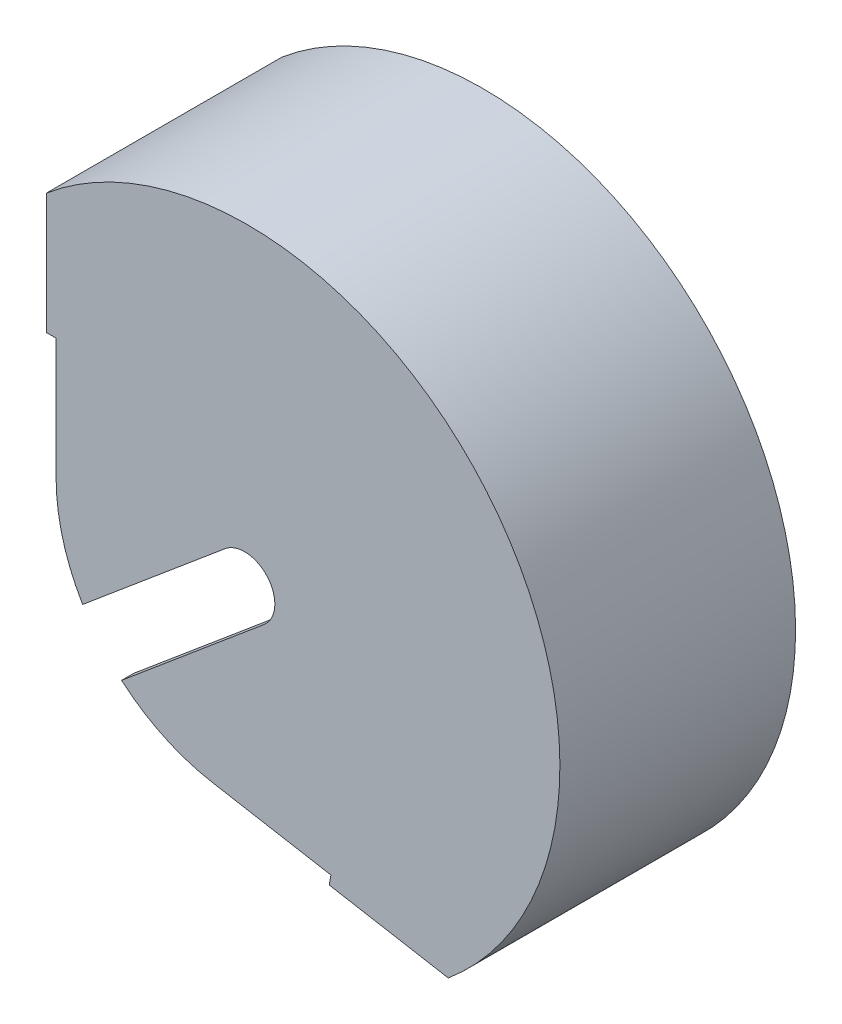
ISO-10303-21;
HEADER;
FILE_DESCRIPTION(('STEP AP214'),'2;1');
FILE_NAME('part.step','',(''),(''),'','','');
FILE_SCHEMA(('AUTOMOTIVE_DESIGN { 1 0 10303 214 1 1 1 1 }'));
ENDSEC;
DATA;
#1=APPLICATION_CONTEXT('core data for automotive mechanical design processes');
#2=APPLICATION_PROTOCOL_DEFINITION('international standard','automotive_design',2000,#1);
#3=PRODUCT_CONTEXT('',#1,'mechanical');
#4=PRODUCT('Part','Part','',(#3));
#5=PRODUCT_RELATED_PRODUCT_CATEGORY('part','',(#4));
#6=PRODUCT_DEFINITION_FORMATION('','',#4);
#7=PRODUCT_DEFINITION_CONTEXT('part definition',#1,'design');
#8=PRODUCT_DEFINITION('design','',#6,#7);
#9=PRODUCT_DEFINITION_SHAPE('','',#8);
#10=(LENGTH_UNIT() NAMED_UNIT(*) SI_UNIT(.MILLI.,.METRE.));
#11=(NAMED_UNIT(*) PLANE_ANGLE_UNIT() SI_UNIT($,.RADIAN.));
#12=(NAMED_UNIT(*) SI_UNIT($,.STERADIAN.) SOLID_ANGLE_UNIT());
#13=UNCERTAINTY_MEASURE_WITH_UNIT(LENGTH_MEASURE(1.E-05),#10,'distance_accuracy_value','');
#14=(GEOMETRIC_REPRESENTATION_CONTEXT(3) GLOBAL_UNCERTAINTY_ASSIGNED_CONTEXT((#13)) GLOBAL_UNIT_ASSIGNED_CONTEXT((#10,
#11,#12)) REPRESENTATION_CONTEXT('',''));
#15=CARTESIAN_POINT('',(0.,0.,0.));
#16=DIRECTION('',(0.,0.,1.));
#17=DIRECTION('',(1.,0.,0.));
#18=AXIS2_PLACEMENT_3D('',#15,#16,#17);
#19=CARTESIAN_POINT('',(0.,0.,46.99));
#20=DIRECTION('',(0.,0.,1.));
#21=DIRECTION('',(1.,0.,0.));
#22=AXIS2_PLACEMENT_3D('',#19,#20,#21);
#23=CYLINDRICAL_SURFACE('',#22,39.624);
#24=DIRECTION('',(0.,0.,1.));
#25=VECTOR('',#24,1.);
#26=CARTESIAN_POINT('',(-34.0431369022995,-20.2762473315773,46.99));
#27=LINE('',#26,#25);
#28=CARTESIAN_POINT('',(-34.0431369022995,-20.2762473315773,46.99));
#29=VERTEX_POINT('',#28);
#30=CARTESIAN_POINT('',(-34.0431369022995,-20.2762473315773,49.53));
#31=VERTEX_POINT('',#30);
#32=EDGE_CURVE('E196',#29,#31,#27,.T.);
#33=ORIENTED_EDGE('',*,*,#32,.T.);
#34=CARTESIAN_POINT('',(0.,0.,49.53));
#35=DIRECTION('',(0.,0.,1.));
#36=DIRECTION('',(1.,0.,0.));
#37=AXIS2_PLACEMENT_3D('',#34,#35,#36);
#38=CIRCLE('',#37,39.624);
#39=CARTESIAN_POINT('',(-39.624,0.,49.53));
#40=VERTEX_POINT('',#39);
#41=EDGE_CURVE('E210',#40,#31,#38,.T.);
#42=ORIENTED_EDGE('',*,*,#41,.F.);
#43=DIRECTION('',(0.,0.,1.));
#44=VECTOR('',#43,1.);
#45=CARTESIAN_POINT('',(-39.624,0.,46.99));
#46=LINE('',#45,#44);
#47=CARTESIAN_POINT('',(-39.624,0.,46.99));
#48=VERTEX_POINT('',#47);
#49=EDGE_CURVE('E234',#48,#40,#46,.T.);
#50=ORIENTED_EDGE('',*,*,#49,.F.);
#51=CARTESIAN_POINT('',(0.,0.,46.99));
#52=DIRECTION('',(0.,0.,1.));
#53=DIRECTION('',(1.,0.,0.));
#54=AXIS2_PLACEMENT_3D('',#51,#52,#53);
#55=CIRCLE('',#54,39.624);
#56=EDGE_CURVE('E212',#48,#29,#55,.T.);
#57=ORIENTED_EDGE('',*,*,#56,.T.);
#58=EDGE_LOOP('',(#33,#42,#50,#57));
#59=FACE_BOUND('',#58,.T.);
#60=ADVANCED_FACE('F44',(#59),#23,.T.);
#61=CARTESIAN_POINT('',(0.,0.,2.54));
#62=DIRECTION('',(0.,0.,1.));
#63=DIRECTION('',(1.,0.,0.));
#64=AXIS2_PLACEMENT_3D('',#61,#62,#63);
#65=PLANE('',#64);
#66=CARTESIAN_POINT('',(0.,0.,2.54));
#67=DIRECTION('',(0.,0.,1.));
#68=DIRECTION('',(1.,0.,0.));
#69=AXIS2_PLACEMENT_3D('',#66,#67,#68);
#70=CIRCLE('',#69,3.81);
#71=CARTESIAN_POINT('',(3.81,0.,2.54));
#72=VERTEX_POINT('',#71);
#73=EDGE_CURVE('E544',#72,#72,#70,.F.);
#74=ORIENTED_EDGE('',*,*,#73,.T.);
#75=EDGE_LOOP('',(#74));
#76=FACE_BOUND('',#75,.T.);
#77=CARTESIAN_POINT('',(2.11621768174401,-33.5316800791596,2.54));
#78=DIRECTION('',(0.,0.,1.));
#79=DIRECTION('',(1.,0.,0.));
#80=AXIS2_PLACEMENT_3D('',#77,#78,#79);
#81=CIRCLE('',#80,3.2639);
#82=CARTESIAN_POINT('',(5.38011768174402,-33.5316800791596,2.54));
#83=VERTEX_POINT('',#82);
#84=EDGE_CURVE('E532',#83,#83,#81,.F.);
#85=ORIENTED_EDGE('',*,*,#84,.T.);
#86=EDGE_LOOP('',(#85));
#87=FACE_BOUND('',#86,.T.);
#88=CARTESIAN_POINT('',(-33.2774928980017,10.1739505809418,2.54));
#89=DIRECTION('',(0.,0.,1.));
#90=DIRECTION('',(1.,0.,0.));
#91=AXIS2_PLACEMENT_3D('',#88,#89,#90);
#92=CIRCLE('',#91,3.2639);
#93=CARTESIAN_POINT('',(-30.0135928980017,10.1739505809418,2.54));
#94=VERTEX_POINT('',#93);
#95=EDGE_CURVE('E528',#94,#94,#92,.F.);
#96=ORIENTED_EDGE('',*,*,#95,.T.);
#97=EDGE_LOOP('',(#96));
#98=FACE_BOUND('',#97,.T.);
#99=CARTESIAN_POINT('',(0.569372682063345,0.477760407521777,2.54));
#100=DIRECTION('',(0.,0.,1.));
#101=DIRECTION('',(1.,0.,0.));
#102=AXIS2_PLACEMENT_3D('',#99,#100,#101);
#103=CIRCLE('',#102,63.1510183795466);
#104=CARTESIAN_POINT('',(41.1620648355229,-47.8987262994342,2.54));
#105=VERTEX_POINT('',#104);
#106=CARTESIAN_POINT('',(-40.0233194713961,48.8542471144778,2.54));
#107=VERTEX_POINT('',#106);
#108=EDGE_CURVE('E68',#105,#107,#103,.T.);
#109=ORIENTED_EDGE('',*,*,#108,.T.);
#110=DIRECTION('',(-1.,0.,0.));
#111=VECTOR('',#110,1.);
#112=CARTESIAN_POINT('',(0.,48.8542471144778,2.54));
#113=LINE('',#112,#111);
#114=CARTESIAN_POINT('',(-41.656,48.8542471144778,2.54));
#115=VERTEX_POINT('',#114);
#116=EDGE_CURVE('E260',#107,#115,#113,.T.);
#117=ORIENTED_EDGE('',*,*,#116,.T.);
#118=DIRECTION('',(0.,1.,0.));
#119=VECTOR('',#118,1.);
#120=CARTESIAN_POINT('',(-41.656,0.,2.54));
#121=LINE('',#120,#119);
#122=CARTESIAN_POINT('',(-41.656,25.4,2.54));
#123=VERTEX_POINT('',#122);
#124=EDGE_CURVE('E308',#123,#115,#121,.T.);
#125=ORIENTED_EDGE('',*,*,#124,.F.);
#126=DIRECTION('',(-1.,0.,0.));
#127=VECTOR('',#126,1.);
#128=CARTESIAN_POINT('',(0.,25.4,2.54));
#129=LINE('',#128,#127);
#130=CARTESIAN_POINT('',(-39.624,25.4,2.54));
#131=VERTEX_POINT('',#130);
#132=EDGE_CURVE('E312',#131,#123,#129,.T.);
#133=ORIENTED_EDGE('',*,*,#132,.F.);
#134=DIRECTION('',(0.,1.,0.));
#135=VECTOR('',#134,1.);
#136=CARTESIAN_POINT('',(-39.624,0.,2.54));
#137=LINE('',#136,#135);
#138=CARTESIAN_POINT('',(-39.624,0.,2.54));
#139=VERTEX_POINT('',#138);
#140=EDGE_CURVE('E291',#139,#131,#137,.T.);
#141=ORIENTED_EDGE('',*,*,#140,.F.);
#142=CARTESIAN_POINT('',(0.,0.,2.54));
#143=DIRECTION('',(0.,0.,1.));
#144=DIRECTION('',(1.,0.,0.));
#145=AXIS2_PLACEMENT_3D('',#142,#143,#144);
#146=CIRCLE('',#145,39.624);
#147=CARTESIAN_POINT('',(-6.88063539187432,-39.0220224053558,2.54));
#148=VERTEX_POINT('',#147);
#149=EDGE_CURVE('E295',#139,#148,#146,.T.);
#150=ORIENTED_EDGE('',*,*,#149,.T.);
#151=DIRECTION('',(0.984807753012209,-0.173648177666927,0.));
#152=VECTOR('',#151,1.);
#153=CARTESIAN_POINT('',(-6.88063539187431,-39.0220224053558,2.54));
#154=LINE('',#153,#152);
#155=CARTESIAN_POINT('',(18.1334815346358,-43.4326861180957,2.54));
#156=VERTEX_POINT('',#155);
#157=EDGE_CURVE('E299',#148,#156,#154,.T.);
#158=ORIENTED_EDGE('',*,*,#157,.T.);
#159=DIRECTION('',(-0.173648177666925,-0.984807753012209,0.));
#160=VECTOR('',#159,1.);
#161=CARTESIAN_POINT('',(25.01411692651,-4.41066371273988,2.54));
#162=LINE('',#161,#160);
#163=CARTESIAN_POINT('',(17.7806284376166,-45.4338154722165,2.54));
#164=VERTEX_POINT('',#163);
#165=EDGE_CURVE('E302',#156,#164,#162,.T.);
#166=ORIENTED_EDGE('',*,*,#165,.T.);
#167=DIRECTION('',(0.984807753012209,-0.173648177666927,0.));
#168=VECTOR('',#167,1.);
#169=CARTESIAN_POINT('',(-7.23348848889351,-41.0231517594766,2.54));
#170=LINE('',#169,#168);
#171=CARTESIAN_POINT('',(40.8785528370185,-49.5066027421954,2.54));
#172=VERTEX_POINT('',#171);
#173=EDGE_CURVE('E305',#164,#172,#170,.T.);
#174=ORIENTED_EDGE('',*,*,#173,.T.);
#175=DIRECTION('',(-0.173648177666925,-0.984807753012209,0.));
#176=VECTOR('',#175,1.);
#177=CARTESIAN_POINT('',(48.112041325912,-8.48345098271867,2.54));
#178=LINE('',#177,#176);
#179=EDGE_CURVE('E270',#105,#172,#178,.T.);
#180=ORIENTED_EDGE('',*,*,#179,.F.);
#181=EDGE_LOOP('',(#109,#117,#125,#133,#141,#150,#158,#166,#174,#180));
#182=FACE_BOUND('',#181,.T.);
#183=ADVANCED_FACE('F388',(#76,#87,#98,#182),#65,.T.);
#184=CARTESIAN_POINT('',(-39.624,0.,2.54));
#185=DIRECTION('',(-1.,0.,0.));
#186=DIRECTION('',(0.,0.,1.));
#187=AXIS2_PLACEMENT_3D('',#184,#185,#186);
#188=PLANE('',#187);
#189=DIRECTION('',(0.,1.,0.));
#190=VECTOR('',#189,1.);
#191=CARTESIAN_POINT('',(-39.624,0.,0.));
#192=LINE('',#191,#190);
#193=CARTESIAN_POINT('',(-39.624,0.,0.));
#194=VERTEX_POINT('',#193);
#195=CARTESIAN_POINT('',(-39.624,25.4,0.));
#196=VERTEX_POINT('',#195);
#197=EDGE_CURVE('E290',#194,#196,#192,.T.);
#198=ORIENTED_EDGE('',*,*,#197,.F.);
#199=DIRECTION('',(0.,0.,-1.));
#200=VECTOR('',#199,1.);
#201=CARTESIAN_POINT('',(-39.624,0.,2.54));
#202=LINE('',#201,#200);
#203=EDGE_CURVE('E11',#139,#194,#202,.T.);
#204=ORIENTED_EDGE('',*,*,#203,.F.);
#205=ORIENTED_EDGE('',*,*,#140,.T.);
#206=DIRECTION('',(0.,0.,-1.));
#207=VECTOR('',#206,1.);
#208=CARTESIAN_POINT('',(-39.624,25.4,2.54));
#209=LINE('',#208,#207);
#210=EDGE_CURVE('E316',#131,#196,#209,.T.);
#211=ORIENTED_EDGE('',*,*,#210,.T.);
#212=EDGE_LOOP('',(#198,#204,#205,#211));
#213=FACE_BOUND('',#212,.T.);
#214=ADVANCED_FACE('F46',(#213),#188,.T.);
#215=CARTESIAN_POINT('',(0.,0.,2.54));
#216=DIRECTION('',(0.,0.,-1.));
#217=DIRECTION('',(-1.,0.,0.));
#218=AXIS2_PLACEMENT_3D('',#215,#216,#217);
#219=CYLINDRICAL_SURFACE('',#218,39.624);
#220=CARTESIAN_POINT('',(0.,0.,0.));
#221=DIRECTION('',(0.,0.,1.));
#222=DIRECTION('',(1.,0.,0.));
#223=AXIS2_PLACEMENT_3D('',#220,#221,#222);
#224=CIRCLE('',#223,39.624);
#225=CARTESIAN_POINT('',(-6.88063539187432,-39.0220224053558,0.));
#226=VERTEX_POINT('',#225);
#227=EDGE_CURVE('E320',#194,#226,#224,.T.);
#228=ORIENTED_EDGE('',*,*,#227,.T.);
#229=DIRECTION('',(0.,0.,-1.));
#230=VECTOR('',#229,1.);
#231=CARTESIAN_POINT('',(-6.88063539187432,-39.0220224053558,2.54));
#232=LINE('',#231,#230);
#233=EDGE_CURVE('E53',#148,#226,#232,.T.);
#234=ORIENTED_EDGE('',*,*,#233,.F.);
#235=ORIENTED_EDGE('',*,*,#149,.F.);
#236=ORIENTED_EDGE('',*,*,#203,.T.);
#237=EDGE_LOOP('',(#228,#234,#235,#236));
#238=FACE_BOUND('',#237,.T.);
#239=ADVANCED_FACE('F411',(#238),#219,.T.);
#240=CARTESIAN_POINT('',(-6.88063539187431,-39.0220224053558,2.54));
#241=DIRECTION('',(0.173648177666927,0.984807753012209,0.));
#242=DIRECTION('',(-0.984807753012209,0.173648177666927,0.));
#243=AXIS2_PLACEMENT_3D('',#240,#241,#242);
#244=PLANE('',#243);
#245=DIRECTION('',(0.984807753012209,-0.173648177666927,0.));
#246=VECTOR('',#245,1.);
#247=CARTESIAN_POINT('',(-6.88063539187431,-39.0220224053558,0.));
#248=LINE('',#247,#246);
#249=CARTESIAN_POINT('',(18.1334815346358,-43.4326861180957,0.));
#250=VERTEX_POINT('',#249);
#251=EDGE_CURVE('E323',#226,#250,#248,.T.);
#252=ORIENTED_EDGE('',*,*,#251,.T.);
#253=DIRECTION('',(0.,0.,-1.));
#254=VECTOR('',#253,1.);
#255=CARTESIAN_POINT('',(18.1334815346358,-43.4326861180957,2.54));
#256=LINE('',#255,#254);
#257=EDGE_CURVE('E359',#156,#250,#256,.T.);
#258=ORIENTED_EDGE('',*,*,#257,.F.);
#259=ORIENTED_EDGE('',*,*,#157,.F.);
#260=ORIENTED_EDGE('',*,*,#233,.T.);
#261=EDGE_LOOP('',(#252,#258,#259,#260));
#262=FACE_BOUND('',#261,.T.);
#263=ADVANCED_FACE('F368',(#262),#244,.F.);
#264=CARTESIAN_POINT('',(25.01411692651,-4.41066371273988,2.54));
#265=DIRECTION('',(0.984807753012209,-0.173648177666925,0.));
#266=DIRECTION('',(0.173648177666925,0.984807753012209,0.));
#267=AXIS2_PLACEMENT_3D('',#264,#265,#266);
#268=PLANE('',#267);
#269=DIRECTION('',(-0.173648177666925,-0.984807753012209,0.));
#270=VECTOR('',#269,1.);
#271=CARTESIAN_POINT('',(25.01411692651,-4.41066371273988,0.));
#272=LINE('',#271,#270);
#273=CARTESIAN_POINT('',(17.7806284376166,-45.4338154722165,0.));
#274=VERTEX_POINT('',#273);
#275=EDGE_CURVE('E326',#250,#274,#272,.T.);
#276=ORIENTED_EDGE('',*,*,#275,.T.);
#277=DIRECTION('',(0.,0.,-1.));
#278=VECTOR('',#277,1.);
#279=CARTESIAN_POINT('',(17.7806284376166,-45.4338154722165,2.54));
#280=LINE('',#279,#278);
#281=EDGE_CURVE('E355',#164,#274,#280,.T.);
#282=ORIENTED_EDGE('',*,*,#281,.F.);
#283=ORIENTED_EDGE('',*,*,#165,.F.);
#284=ORIENTED_EDGE('',*,*,#257,.T.);
#285=EDGE_LOOP('',(#276,#282,#283,#284));
#286=FACE_BOUND('',#285,.T.);
#287=ADVANCED_FACE('F381',(#286),#268,.F.);
#288=CARTESIAN_POINT('',(-7.23348848889351,-41.0231517594766,2.54));
#289=DIRECTION('',(0.173648177666927,0.984807753012209,0.));
#290=DIRECTION('',(-0.984807753012209,0.173648177666927,0.));
#291=AXIS2_PLACEMENT_3D('',#288,#289,#290);
#292=PLANE('',#291);
#293=DIRECTION('',(0.984807753012209,-0.173648177666927,0.));
#294=VECTOR('',#293,1.);
#295=CARTESIAN_POINT('',(-7.23348848889351,-41.0231517594766,0.));
#296=LINE('',#295,#294);
#297=CARTESIAN_POINT('',(42.7947453641267,-49.8444791849564,0.));
#298=VERTEX_POINT('',#297);
#299=EDGE_CURVE('E329',#274,#298,#296,.T.);
#300=ORIENTED_EDGE('',*,*,#299,.T.);
#301=DIRECTION('',(0.,0.,-1.));
#302=VECTOR('',#301,1.);
#303=CARTESIAN_POINT('',(42.7947453641267,-49.8444791849564,2.54));
#304=LINE('',#303,#302);
#305=CARTESIAN_POINT('',(42.7947453641267,-49.8444791849564,49.53));
#306=VERTEX_POINT('',#305);
#307=EDGE_CURVE('E351',#306,#298,#304,.T.);
#308=ORIENTED_EDGE('',*,*,#307,.F.);
#309=DIRECTION('',(0.984807753012209,-0.173648177666927,0.));
#310=VECTOR('',#309,1.);
#311=CARTESIAN_POINT('',(-7.23348848889351,-41.0231517594766,49.53));
#312=LINE('',#311,#310);
#313=CARTESIAN_POINT('',(17.7806284376166,-45.4338154722165,49.53));
#314=VERTEX_POINT('',#313);
#315=EDGE_CURVE('E478',#314,#306,#312,.T.);
#316=ORIENTED_EDGE('',*,*,#315,.F.);
#317=DIRECTION('',(0.,0.,1.));
#318=VECTOR('',#317,1.);
#319=CARTESIAN_POINT('',(17.7806284376166,-45.4338154722165,46.99));
#320=LINE('',#319,#318);
#321=CARTESIAN_POINT('',(17.7806284376166,-45.4338154722165,46.99));
#322=VERTEX_POINT('',#321);
#323=EDGE_CURVE('E244',#322,#314,#320,.T.);
#324=ORIENTED_EDGE('',*,*,#323,.F.);
#325=DIRECTION('',(0.984807753012209,-0.173648177666927,0.));
#326=VECTOR('',#325,1.);
#327=CARTESIAN_POINT('',(-7.23348848889351,-41.0231517594766,46.99));
#328=LINE('',#327,#326);
#329=CARTESIAN_POINT('',(40.8785528370185,-49.5066027421954,46.99));
#330=VERTEX_POINT('',#329);
#331=EDGE_CURVE('E515',#322,#330,#328,.T.);
#332=ORIENTED_EDGE('',*,*,#331,.T.);
#333=DIRECTION('',(0.,0.,-1.));
#334=VECTOR('',#333,1.);
#335=CARTESIAN_POINT('',(40.8785528370185,-49.5066027421954,46.99));
#336=LINE('',#335,#334);
#337=EDGE_CURVE('E282',#330,#172,#336,.T.);
#338=ORIENTED_EDGE('',*,*,#337,.T.);
#339=ORIENTED_EDGE('',*,*,#173,.F.);
#340=ORIENTED_EDGE('',*,*,#281,.T.);
#341=EDGE_LOOP('',(#300,#308,#316,#324,#332,#338,#339,#340));
#342=FACE_BOUND('',#341,.T.);
#343=ADVANCED_FACE('F385',(#342),#292,.F.);
#344=CARTESIAN_POINT('',(0.569372682063345,0.477760407521777,2.54));
#345=DIRECTION('',(0.,0.,-1.));
#346=DIRECTION('',(-1.,0.,0.));
#347=AXIS2_PLACEMENT_3D('',#344,#345,#346);
#348=CYLINDRICAL_SURFACE('',#347,65.6910183795466);
#349=CARTESIAN_POINT('',(0.569372682063345,0.477760407521777,0.));
#350=DIRECTION('',(0.,0.,1.));
#351=DIRECTION('',(1.,0.,0.));
#352=AXIS2_PLACEMENT_3D('',#349,#350,#351);
#353=CIRCLE('',#352,65.6910183795466);
#354=CARTESIAN_POINT('',(-41.656,50.8,0.));
#355=VERTEX_POINT('',#354);
#356=EDGE_CURVE('E332',#298,#355,#353,.T.);
#357=ORIENTED_EDGE('',*,*,#356,.T.);
#358=DIRECTION('',(0.,0.,-1.));
#359=VECTOR('',#358,1.);
#360=CARTESIAN_POINT('',(-41.656,50.8,2.54));
#361=LINE('',#360,#359);
#362=CARTESIAN_POINT('',(-41.656,50.8,49.53));
#363=VERTEX_POINT('',#362);
#364=EDGE_CURVE('E348',#363,#355,#361,.T.);
#365=ORIENTED_EDGE('',*,*,#364,.F.);
#366=CARTESIAN_POINT('',(0.569372682063345,0.477760407521777,49.53));
#367=DIRECTION('',(0.,0.,1.));
#368=DIRECTION('',(1.,0.,0.));
#369=AXIS2_PLACEMENT_3D('',#366,#367,#368);
#370=CIRCLE('',#369,65.6910183795466);
#371=EDGE_CURVE('E474',#306,#363,#370,.T.);
#372=ORIENTED_EDGE('',*,*,#371,.F.);
#373=ORIENTED_EDGE('',*,*,#307,.T.);
#374=EDGE_LOOP('',(#357,#365,#372,#373));
#375=FACE_BOUND('',#374,.T.);
#376=ADVANCED_FACE('F495',(#375),#348,.T.);
#377=CARTESIAN_POINT('',(-41.656,0.,2.54));
#378=DIRECTION('',(-1.,0.,0.));
#379=DIRECTION('',(0.,0.,1.));
#380=AXIS2_PLACEMENT_3D('',#377,#378,#379);
#381=PLANE('',#380);
#382=DIRECTION('',(0.,1.,0.));
#383=VECTOR('',#382,1.);
#384=CARTESIAN_POINT('',(-41.656,0.,0.));
#385=LINE('',#384,#383);
#386=CARTESIAN_POINT('',(-41.656,25.4,0.));
#387=VERTEX_POINT('',#386);
#388=EDGE_CURVE('E336',#387,#355,#385,.T.);
#389=ORIENTED_EDGE('',*,*,#388,.F.);
#390=DIRECTION('',(0.,0.,-1.));
#391=VECTOR('',#390,1.);
#392=CARTESIAN_POINT('',(-41.656,25.4,2.54));
#393=LINE('',#392,#391);
#394=EDGE_CURVE('E345',#123,#387,#393,.T.);
#395=ORIENTED_EDGE('',*,*,#394,.F.);
#396=ORIENTED_EDGE('',*,*,#124,.T.);
#397=DIRECTION('',(0.,0.,-1.));
#398=VECTOR('',#397,1.);
#399=CARTESIAN_POINT('',(-41.656,48.8542471144778,46.99));
#400=LINE('',#399,#398);
#401=CARTESIAN_POINT('',(-41.656,48.8542471144778,46.99));
#402=VERTEX_POINT('',#401);
#403=EDGE_CURVE('E278',#402,#115,#400,.T.);
#404=ORIENTED_EDGE('',*,*,#403,.F.);
#405=DIRECTION('',(0.,1.,0.));
#406=VECTOR('',#405,1.);
#407=CARTESIAN_POINT('',(-41.656,0.,46.99));
#408=LINE('',#407,#406);
#409=CARTESIAN_POINT('',(-41.656,25.4,46.99));
#410=VERTEX_POINT('',#409);
#411=EDGE_CURVE('E497',#410,#402,#408,.T.);
#412=ORIENTED_EDGE('',*,*,#411,.F.);
#413=DIRECTION('',(0.,0.,1.));
#414=VECTOR('',#413,1.);
#415=CARTESIAN_POINT('',(-41.656,25.4,46.99));
#416=LINE('',#415,#414);
#417=CARTESIAN_POINT('',(-41.656,25.4,49.53));
#418=VERTEX_POINT('',#417);
#419=EDGE_CURVE('E247',#410,#418,#416,.T.);
#420=ORIENTED_EDGE('',*,*,#419,.T.);
#421=DIRECTION('',(0.,1.,0.));
#422=VECTOR('',#421,1.);
#423=CARTESIAN_POINT('',(-41.656,0.,49.53));
#424=LINE('',#423,#422);
#425=EDGE_CURVE('E470',#418,#363,#424,.T.);
#426=ORIENTED_EDGE('',*,*,#425,.T.);
#427=ORIENTED_EDGE('',*,*,#364,.T.);
#428=EDGE_LOOP('',(#389,#395,#396,#404,#412,#420,#426,#427));
#429=FACE_BOUND('',#428,.T.);
#430=ADVANCED_FACE('F404',(#429),#381,.T.);
#431=CARTESIAN_POINT('',(0.,25.4,2.54));
#432=DIRECTION('',(0.,-1.,0.));
#433=DIRECTION('',(0.,0.,-1.));
#434=AXIS2_PLACEMENT_3D('',#431,#432,#433);
#435=PLANE('',#434);
#436=DIRECTION('',(-1.,0.,0.));
#437=VECTOR('',#436,1.);
#438=CARTESIAN_POINT('',(0.,25.4,0.));
#439=LINE('',#438,#437);
#440=EDGE_CURVE('E296',#196,#387,#439,.T.);
#441=ORIENTED_EDGE('',*,*,#440,.F.);
#442=ORIENTED_EDGE('',*,*,#210,.F.);
#443=ORIENTED_EDGE('',*,*,#132,.T.);
#444=ORIENTED_EDGE('',*,*,#394,.T.);
#445=EDGE_LOOP('',(#441,#442,#443,#444));
#446=FACE_BOUND('',#445,.T.);
#447=ADVANCED_FACE('F408',(#446),#435,.T.);
#448=CARTESIAN_POINT('',(0.,0.,0.));
#449=DIRECTION('',(0.,0.,1.));
#450=DIRECTION('',(1.,0.,0.));
#451=AXIS2_PLACEMENT_3D('',#448,#449,#450);
#452=PLANE('',#451);
#453=CARTESIAN_POINT('',(0.,0.,0.));
#454=DIRECTION('',(0.,0.,-1.));
#455=DIRECTION('',(-1.,0.,0.));
#456=AXIS2_PLACEMENT_3D('',#453,#454,#455);
#457=CIRCLE('',#456,3.81);
#458=CARTESIAN_POINT('',(-3.81,0.,0.));
#459=VERTEX_POINT('',#458);
#460=EDGE_CURVE('E537',#459,#459,#457,.T.);
#461=ORIENTED_EDGE('',*,*,#460,.F.);
#462=EDGE_LOOP('',(#461));
#463=FACE_BOUND('',#462,.T.);
#464=CARTESIAN_POINT('',(2.11621768174401,-33.5316800791596,0.));
#465=DIRECTION('',(0.,0.,-1.));
#466=DIRECTION('',(-1.,0.,0.));
#467=AXIS2_PLACEMENT_3D('',#464,#465,#466);
#468=CIRCLE('',#467,3.2639);
#469=CARTESIAN_POINT('',(-1.14768231825599,-33.5316800791596,0.));
#470=VERTEX_POINT('',#469);
#471=EDGE_CURVE('E215',#470,#470,#468,.T.);
#472=ORIENTED_EDGE('',*,*,#471,.F.);
#473=EDGE_LOOP('',(#472));
#474=FACE_BOUND('',#473,.T.);
#475=CARTESIAN_POINT('',(-33.2774928980017,10.1739505809418,0.));
#476=DIRECTION('',(0.,0.,-1.));
#477=DIRECTION('',(-1.,0.,0.));
#478=AXIS2_PLACEMENT_3D('',#475,#476,#477);
#479=CIRCLE('',#478,3.2639);
#480=CARTESIAN_POINT('',(-36.5413928980017,10.1739505809418,0.));
#481=VERTEX_POINT('',#480);
#482=EDGE_CURVE('E533',#481,#481,#479,.T.);
#483=ORIENTED_EDGE('',*,*,#482,.F.);
#484=EDGE_LOOP('',(#483));
#485=FACE_BOUND('',#484,.T.);
#486=ORIENTED_EDGE('',*,*,#197,.T.);
#487=ORIENTED_EDGE('',*,*,#440,.T.);
#488=ORIENTED_EDGE('',*,*,#388,.T.);
#489=ORIENTED_EDGE('',*,*,#356,.F.);
#490=ORIENTED_EDGE('',*,*,#299,.F.);
#491=ORIENTED_EDGE('',*,*,#275,.F.);
#492=ORIENTED_EDGE('',*,*,#251,.F.);
#493=ORIENTED_EDGE('',*,*,#227,.F.);
#494=EDGE_LOOP('',(#486,#487,#488,#489,#490,#491,#492,#493));
#495=FACE_BOUND('',#494,.T.);
#496=ADVANCED_FACE('F375',(#463,#474,#485,#495),#452,.F.);
#497=CARTESIAN_POINT('',(0.569372682063345,0.477760407521777,46.99));
#498=DIRECTION('',(0.,0.,-1.));
#499=DIRECTION('',(-1.,0.,0.));
#500=AXIS2_PLACEMENT_3D('',#497,#498,#499);
#501=CYLINDRICAL_SURFACE('',#500,63.1510183795466);
#502=ORIENTED_EDGE('',*,*,#108,.F.);
#503=DIRECTION('',(0.,0.,-1.));
#504=VECTOR('',#503,1.);
#505=CARTESIAN_POINT('',(41.1620648355229,-47.8987262994342,46.99));
#506=LINE('',#505,#504);
#507=CARTESIAN_POINT('',(41.1620648355229,-47.8987262994342,46.99));
#508=VERTEX_POINT('',#507);
#509=EDGE_CURVE('E286',#508,#105,#506,.T.);
#510=ORIENTED_EDGE('',*,*,#509,.F.);
#511=CARTESIAN_POINT('',(0.569372682063345,0.477760407521777,46.99));
#512=DIRECTION('',(0.,0.,1.));
#513=DIRECTION('',(1.,0.,0.));
#514=AXIS2_PLACEMENT_3D('',#511,#512,#513);
#515=CIRCLE('',#514,63.1510183795466);
#516=CARTESIAN_POINT('',(-40.0233194713961,48.8542471144778,46.99));
#517=VERTEX_POINT('',#516);
#518=EDGE_CURVE('E255',#508,#517,#515,.T.);
#519=ORIENTED_EDGE('',*,*,#518,.T.);
#520=DIRECTION('',(0.,0.,-1.));
#521=VECTOR('',#520,1.);
#522=CARTESIAN_POINT('',(-40.0233194713961,48.8542471144778,46.99));
#523=LINE('',#522,#521);
#524=EDGE_CURVE('E267',#517,#107,#523,.T.);
#525=ORIENTED_EDGE('',*,*,#524,.T.);
#526=EDGE_LOOP('',(#502,#510,#519,#525));
#527=FACE_BOUND('',#526,.T.);
#528=ADVANCED_FACE('F394',(#527),#501,.F.);
#529=CARTESIAN_POINT('',(48.112041325912,-8.48345098271867,46.99));
#530=DIRECTION('',(0.984807753012209,-0.173648177666925,0.));
#531=DIRECTION('',(0.173648177666925,0.984807753012209,0.));
#532=AXIS2_PLACEMENT_3D('',#529,#530,#531);
#533=PLANE('',#532);
#534=ORIENTED_EDGE('',*,*,#179,.T.);
#535=ORIENTED_EDGE('',*,*,#337,.F.);
#536=DIRECTION('',(-0.173648177666925,-0.984807753012209,0.));
#537=VECTOR('',#536,1.);
#538=CARTESIAN_POINT('',(48.112041325912,-8.48345098271867,46.99));
#539=LINE('',#538,#537);
#540=EDGE_CURVE('E259',#508,#330,#539,.T.);
#541=ORIENTED_EDGE('',*,*,#540,.F.);
#542=ORIENTED_EDGE('',*,*,#509,.T.);
#543=EDGE_LOOP('',(#534,#535,#541,#542));
#544=FACE_BOUND('',#543,.T.);
#545=ADVANCED_FACE('F390',(#544),#533,.F.);
#546=CARTESIAN_POINT('',(0.,48.8542471144778,46.99));
#547=DIRECTION('',(0.,-1.,0.));
#548=DIRECTION('',(0.,0.,-1.));
#549=AXIS2_PLACEMENT_3D('',#546,#547,#548);
#550=PLANE('',#549);
#551=ORIENTED_EDGE('',*,*,#116,.F.);
#552=ORIENTED_EDGE('',*,*,#524,.F.);
#553=DIRECTION('',(-1.,0.,0.));
#554=VECTOR('',#553,1.);
#555=CARTESIAN_POINT('',(0.,48.8542471144778,46.99));
#556=LINE('',#555,#554);
#557=EDGE_CURVE('E263',#517,#402,#556,.T.);
#558=ORIENTED_EDGE('',*,*,#557,.T.);
#559=ORIENTED_EDGE('',*,*,#403,.T.);
#560=EDGE_LOOP('',(#551,#552,#558,#559));
#561=FACE_BOUND('',#560,.T.);
#562=ADVANCED_FACE('F398',(#561),#550,.T.);
#563=CARTESIAN_POINT('',(-39.624,0.,46.99));
#564=DIRECTION('',(1.,0.,0.));
#565=DIRECTION('',(0.,0.,-1.));
#566=AXIS2_PLACEMENT_3D('',#563,#564,#565);
#567=PLANE('',#566);
#568=DIRECTION('',(0.,1.,0.));
#569=VECTOR('',#568,1.);
#570=CARTESIAN_POINT('',(-39.624,0.,49.53));
#571=LINE('',#570,#569);
#572=CARTESIAN_POINT('',(-39.624,25.4,49.53));
#573=VERTEX_POINT('',#572);
#574=EDGE_CURVE('E220',#40,#573,#571,.T.);
#575=ORIENTED_EDGE('',*,*,#574,.T.);
#576=DIRECTION('',(0.,0.,1.));
#577=VECTOR('',#576,1.);
#578=CARTESIAN_POINT('',(-39.624,25.4,46.99));
#579=LINE('',#578,#577);
#580=CARTESIAN_POINT('',(-39.624,25.4,46.99));
#581=VERTEX_POINT('',#580);
#582=EDGE_CURVE('E251',#581,#573,#579,.T.);
#583=ORIENTED_EDGE('',*,*,#582,.F.);
#584=DIRECTION('',(0.,1.,0.));
#585=VECTOR('',#584,1.);
#586=CARTESIAN_POINT('',(-39.624,0.,46.99));
#587=LINE('',#586,#585);
#588=EDGE_CURVE('E222',#48,#581,#587,.T.);
#589=ORIENTED_EDGE('',*,*,#588,.F.);
#590=ORIENTED_EDGE('',*,*,#49,.T.);
#591=EDGE_LOOP('',(#575,#583,#589,#590));
#592=FACE_BOUND('',#591,.T.);
#593=ADVANCED_FACE('F503',(#592),#567,.F.);
#594=CARTESIAN_POINT('',(0.,25.4,46.99));
#595=DIRECTION('',(0.,1.,0.));
#596=DIRECTION('',(0.,0.,1.));
#597=AXIS2_PLACEMENT_3D('',#594,#595,#596);
#598=PLANE('',#597);
#599=DIRECTION('',(-1.,0.,0.));
#600=VECTOR('',#599,1.);
#601=CARTESIAN_POINT('',(0.,25.4,49.53));
#602=LINE('',#601,#600);
#603=EDGE_CURVE('E466',#573,#418,#602,.T.);
#604=ORIENTED_EDGE('',*,*,#603,.T.);
#605=ORIENTED_EDGE('',*,*,#419,.F.);
#606=DIRECTION('',(-1.,0.,0.));
#607=VECTOR('',#606,1.);
#608=CARTESIAN_POINT('',(0.,25.4,46.99));
#609=LINE('',#608,#607);
#610=EDGE_CURVE('E228',#581,#410,#609,.T.);
#611=ORIENTED_EDGE('',*,*,#610,.F.);
#612=ORIENTED_EDGE('',*,*,#582,.T.);
#613=EDGE_LOOP('',(#604,#605,#611,#612));
#614=FACE_BOUND('',#613,.T.);
#615=ADVANCED_FACE('F499',(#614),#598,.F.);
#616=CARTESIAN_POINT('',(25.01411692651,-4.41066371273988,46.99));
#617=DIRECTION('',(-0.984807753012209,0.173648177666925,0.));
#618=DIRECTION('',(-0.173648177666925,-0.984807753012209,0.));
#619=AXIS2_PLACEMENT_3D('',#616,#617,#618);
#620=PLANE('',#619);
#621=DIRECTION('',(-0.173648177666925,-0.984807753012209,0.));
#622=VECTOR('',#621,1.);
#623=CARTESIAN_POINT('',(25.01411692651,-4.41066371273988,49.53));
#624=LINE('',#623,#622);
#625=CARTESIAN_POINT('',(18.1334815346358,-43.4326861180957,49.53));
#626=VERTEX_POINT('',#625);
#627=EDGE_CURVE('E481',#626,#314,#624,.T.);
#628=ORIENTED_EDGE('',*,*,#627,.F.);
#629=DIRECTION('',(0.,0.,1.));
#630=VECTOR('',#629,1.);
#631=CARTESIAN_POINT('',(18.1334815346358,-43.4326861180957,46.99));
#632=LINE('',#631,#630);
#633=CARTESIAN_POINT('',(18.1334815346358,-43.4326861180957,46.99));
#634=VERTEX_POINT('',#633);
#635=EDGE_CURVE('E241',#634,#626,#632,.T.);
#636=ORIENTED_EDGE('',*,*,#635,.F.);
#637=DIRECTION('',(-0.173648177666925,-0.984807753012209,0.));
#638=VECTOR('',#637,1.);
#639=CARTESIAN_POINT('',(25.01411692651,-4.41066371273988,46.99));
#640=LINE('',#639,#638);
#641=EDGE_CURVE('E460',#634,#322,#640,.T.);
#642=ORIENTED_EDGE('',*,*,#641,.T.);
#643=ORIENTED_EDGE('',*,*,#323,.T.);
#644=EDGE_LOOP('',(#628,#636,#642,#643));
#645=FACE_BOUND('',#644,.T.);
#646=ADVANCED_FACE('F439',(#645),#620,.T.);
#647=CARTESIAN_POINT('',(-6.88063539187431,-39.0220224053558,46.99));
#648=DIRECTION('',(-0.173648177666927,-0.984807753012209,0.));
#649=DIRECTION('',(0.984807753012209,-0.173648177666927,0.));
#650=AXIS2_PLACEMENT_3D('',#647,#648,#649);
#651=PLANE('',#650);
#652=DIRECTION('',(0.984807753012209,-0.173648177666927,0.));
#653=VECTOR('',#652,1.);
#654=CARTESIAN_POINT('',(-6.88063539187431,-39.0220224053558,49.53));
#655=LINE('',#654,#653);
#656=CARTESIAN_POINT('',(-6.88063539187432,-39.0220224053558,49.53));
#657=VERTEX_POINT('',#656);
#658=EDGE_CURVE('E230',#657,#626,#655,.T.);
#659=ORIENTED_EDGE('',*,*,#658,.F.);
#660=DIRECTION('',(0.,0.,1.));
#661=VECTOR('',#660,1.);
#662=CARTESIAN_POINT('',(-6.88063539187432,-39.0220224053558,46.99));
#663=LINE('',#662,#661);
#664=CARTESIAN_POINT('',(-6.88063539187432,-39.0220224053558,46.99));
#665=VERTEX_POINT('',#664);
#666=EDGE_CURVE('E237',#665,#657,#663,.T.);
#667=ORIENTED_EDGE('',*,*,#666,.F.);
#668=DIRECTION('',(0.984807753012209,-0.173648177666927,0.));
#669=VECTOR('',#668,1.);
#670=CARTESIAN_POINT('',(-6.88063539187431,-39.0220224053558,46.99));
#671=LINE('',#670,#669);
#672=EDGE_CURVE('E455',#665,#634,#671,.T.);
#673=ORIENTED_EDGE('',*,*,#672,.T.);
#674=ORIENTED_EDGE('',*,*,#635,.T.);
#675=EDGE_LOOP('',(#659,#667,#673,#674));
#676=FACE_BOUND('',#675,.T.);
#677=ADVANCED_FACE('F431',(#676),#651,.T.);
#678=DIRECTION('',(0.,0.,1.));
#679=VECTOR('',#678,1.);
#680=CARTESIAN_POINT('',(-25.8797342592804,-30.0050117591883,46.99));
#681=LINE('',#680,#679);
#682=CARTESIAN_POINT('',(-25.8797342592804,-30.0050117591883,49.53));
#683=VERTEX_POINT('',#682);
#684=CARTESIAN_POINT('',(-25.8797342592804,-30.0050117591883,46.99));
#685=VERTEX_POINT('',#684);
#686=EDGE_CURVE('E214',#683,#685,#681,.F.);
#687=ORIENTED_EDGE('',*,*,#686,.T.);
#688=EDGE_CURVE('E444',#685,#665,#55,.T.);
#689=ORIENTED_EDGE('',*,*,#688,.T.);
#690=ORIENTED_EDGE('',*,*,#666,.T.);
#691=EDGE_CURVE('E223',#683,#657,#38,.T.);
#692=ORIENTED_EDGE('',*,*,#691,.F.);
#693=EDGE_LOOP('',(#687,#689,#690,#692));
#694=FACE_BOUND('',#693,.T.);
#695=ADVANCED_FACE('F420',(#694),#23,.T.);
#696=CARTESIAN_POINT('',(0.,0.,46.99));
#697=DIRECTION('',(0.,0.,-1.));
#698=DIRECTION('',(1.,0.,0.));
#699=AXIS2_PLACEMENT_3D('',#696,#697,#698);
#700=PLANE('',#699);
#701=DIRECTION('',(-0.766044443118977,-0.642787609686541,0.));
#702=VECTOR('',#701,1.);
#703=CARTESIAN_POINT('',(-4.08170132150953,4.8643822138055,46.99));
#704=LINE('',#703,#702);
#705=CARTESIAN_POINT('',(-4.08170132150953,4.8643822138055,46.99));
#706=VERTEX_POINT('',#705);
#707=EDGE_CURVE('E467',#706,#29,#704,.T.);
#708=ORIENTED_EDGE('',*,*,#707,.T.);
#709=ORIENTED_EDGE('',*,*,#56,.F.);
#710=ORIENTED_EDGE('',*,*,#588,.T.);
#711=ORIENTED_EDGE('',*,*,#610,.T.);
#712=ORIENTED_EDGE('',*,*,#411,.T.);
#713=ORIENTED_EDGE('',*,*,#557,.F.);
#714=ORIENTED_EDGE('',*,*,#518,.F.);
#715=ORIENTED_EDGE('',*,*,#540,.T.);
#716=ORIENTED_EDGE('',*,*,#331,.F.);
#717=ORIENTED_EDGE('',*,*,#641,.F.);
#718=ORIENTED_EDGE('',*,*,#672,.F.);
#719=ORIENTED_EDGE('',*,*,#688,.F.);
#720=DIRECTION('',(0.766044443118977,0.642787609686541,0.));
#721=VECTOR('',#720,1.);
#722=CARTESIAN_POINT('',(-28.9960977323679,-32.6199512000703,46.99));
#723=LINE('',#722,#721);
#724=CARTESIAN_POINT('',(4.08170132150954,-4.8643822138055,46.99));
#725=VERTEX_POINT('',#724);
#726=EDGE_CURVE('E452',#685,#725,#723,.T.);
#727=ORIENTED_EDGE('',*,*,#726,.T.);
#728=CARTESIAN_POINT('',(0.,0.,46.99));
#729=DIRECTION('',(0.,0.,-1.));
#730=DIRECTION('',(-1.,0.,0.));
#731=AXIS2_PLACEMENT_3D('',#728,#729,#730);
#732=CIRCLE('',#731,6.35);
#733=EDGE_CURVE('E447',#725,#706,#732,.F.);
#734=ORIENTED_EDGE('',*,*,#733,.T.);
#735=EDGE_LOOP('',(#708,#709,#710,#711,#712,#713,#714,#715,#716,#717,#718,#719,#727,#734));
#736=FACE_BOUND('',#735,.T.);
#737=ADVANCED_FACE('F430',(#736),#700,.T.);
#738=CARTESIAN_POINT('',(0.,0.,49.53));
#739=DIRECTION('',(0.,0.,-1.));
#740=DIRECTION('',(1.,0.,0.));
#741=AXIS2_PLACEMENT_3D('',#738,#739,#740);
#742=PLANE('',#741);
#743=ORIENTED_EDGE('',*,*,#41,.T.);
#744=DIRECTION('',(-0.766044443118977,-0.642787609686541,0.));
#745=VECTOR('',#744,1.);
#746=CARTESIAN_POINT('',(-4.08170132150953,4.8643822138055,49.53));
#747=LINE('',#746,#745);
#748=CARTESIAN_POINT('',(-4.08170132150953,4.8643822138055,49.53));
#749=VERTEX_POINT('',#748);
#750=EDGE_CURVE('E193',#749,#31,#747,.T.);
#751=ORIENTED_EDGE('',*,*,#750,.F.);
#752=CARTESIAN_POINT('',(0.,0.,49.53));
#753=DIRECTION('',(0.,0.,1.));
#754=DIRECTION('',(1.,0.,0.));
#755=AXIS2_PLACEMENT_3D('',#752,#753,#754);
#756=CIRCLE('',#755,6.35);
#757=CARTESIAN_POINT('',(4.08170132150954,-4.8643822138055,49.53));
#758=VERTEX_POINT('',#757);
#759=EDGE_CURVE('E205',#758,#749,#756,.T.);
#760=ORIENTED_EDGE('',*,*,#759,.F.);
#761=DIRECTION('',(0.766044443118977,0.642787609686541,0.));
#762=VECTOR('',#761,1.);
#763=CARTESIAN_POINT('',(-28.9960977323679,-32.6199512000703,49.53));
#764=LINE('',#763,#762);
#765=EDGE_CURVE('E60',#683,#758,#764,.T.);
#766=ORIENTED_EDGE('',*,*,#765,.F.);
#767=ORIENTED_EDGE('',*,*,#691,.T.);
#768=ORIENTED_EDGE('',*,*,#658,.T.);
#769=ORIENTED_EDGE('',*,*,#627,.T.);
#770=ORIENTED_EDGE('',*,*,#315,.T.);
#771=ORIENTED_EDGE('',*,*,#371,.T.);
#772=ORIENTED_EDGE('',*,*,#425,.F.);
#773=ORIENTED_EDGE('',*,*,#603,.F.);
#774=ORIENTED_EDGE('',*,*,#574,.F.);
#775=EDGE_LOOP('',(#743,#751,#760,#766,#767,#768,#769,#770,#771,#772,#773,#774));
#776=FACE_BOUND('',#775,.T.);
#777=ADVANCED_FACE('F218',(#776),#742,.F.);
#778=CARTESIAN_POINT('',(-4.08170132150953,4.8643822138055,-0.001000000000001));
#779=DIRECTION('',(-0.642787609686541,0.766044443118977,0.));
#780=DIRECTION('',(-0.766044443118977,-0.642787609686541,0.));
#781=AXIS2_PLACEMENT_3D('',#778,#779,#780);
#782=PLANE('',#781);
#783=ORIENTED_EDGE('',*,*,#707,.F.);
#784=DIRECTION('',(0.,0.,1.));
#785=VECTOR('',#784,1.);
#786=CARTESIAN_POINT('',(-4.08170132150953,4.8643822138055,-0.001000000000001));
#787=LINE('',#786,#785);
#788=EDGE_CURVE('E199',#706,#749,#787,.T.);
#789=ORIENTED_EDGE('',*,*,#788,.T.);
#790=ORIENTED_EDGE('',*,*,#750,.T.);
#791=ORIENTED_EDGE('',*,*,#32,.F.);
#792=EDGE_LOOP('',(#783,#789,#790,#791));
#793=FACE_BOUND('',#792,.T.);
#794=ADVANCED_FACE('F195',(#793),#782,.F.);
#795=CARTESIAN_POINT('',(-28.9960977323679,-32.6199512000703,-0.001000000000001));
#796=DIRECTION('',(0.642787609686541,-0.766044443118977,0.));
#797=DIRECTION('',(0.766044443118977,0.642787609686541,0.));
#798=AXIS2_PLACEMENT_3D('',#795,#796,#797);
#799=PLANE('',#798);
#800=ORIENTED_EDGE('',*,*,#765,.T.);
#801=DIRECTION('',(0.,0.,1.));
#802=VECTOR('',#801,1.);
#803=CARTESIAN_POINT('',(4.08170132150954,-4.8643822138055,-0.001000000000001));
#804=LINE('',#803,#802);
#805=EDGE_CURVE('E505',#725,#758,#804,.T.);
#806=ORIENTED_EDGE('',*,*,#805,.F.);
#807=ORIENTED_EDGE('',*,*,#726,.F.);
#808=ORIENTED_EDGE('',*,*,#686,.F.);
#809=EDGE_LOOP('',(#800,#806,#807,#808));
#810=FACE_BOUND('',#809,.T.);
#811=ADVANCED_FACE('F573',(#810),#799,.F.);
#812=CARTESIAN_POINT('',(0.,0.,-0.001000000000001));
#813=DIRECTION('',(0.,0.,1.));
#814=DIRECTION('',(1.,0.,0.));
#815=AXIS2_PLACEMENT_3D('',#812,#813,#814);
#816=CYLINDRICAL_SURFACE('',#815,6.35);
#817=ORIENTED_EDGE('',*,*,#805,.T.);
#818=ORIENTED_EDGE('',*,*,#759,.T.);
#819=ORIENTED_EDGE('',*,*,#788,.F.);
#820=ORIENTED_EDGE('',*,*,#733,.F.);
#821=EDGE_LOOP('',(#817,#818,#819,#820));
#822=FACE_BOUND('',#821,.T.);
#823=ADVANCED_FACE('F564',(#822),#816,.F.);
#824=CARTESIAN_POINT('',(-33.2774928980017,10.1739505809418,49.531));
#825=DIRECTION('',(0.,0.,-1.));
#826=DIRECTION('',(-1.,0.,0.));
#827=AXIS2_PLACEMENT_3D('',#824,#825,#826);
#828=CYLINDRICAL_SURFACE('',#827,3.2639);
#829=ORIENTED_EDGE('',*,*,#95,.F.);
#830=EDGE_LOOP('',(#829));
#831=FACE_BOUND('',#830,.T.);
#832=ORIENTED_EDGE('',*,*,#482,.T.);
#833=EDGE_LOOP('',(#832));
#834=FACE_BOUND('',#833,.T.);
#835=ADVANCED_FACE('F561',(#831,#834),#828,.F.);
#836=CARTESIAN_POINT('',(2.11621768174401,-33.5316800791596,49.531));
#837=DIRECTION('',(0.,0.,-1.));
#838=DIRECTION('',(-1.,0.,0.));
#839=AXIS2_PLACEMENT_3D('',#836,#837,#838);
#840=CYLINDRICAL_SURFACE('',#839,3.2639);
#841=ORIENTED_EDGE('',*,*,#84,.F.);
#842=EDGE_LOOP('',(#841));
#843=FACE_BOUND('',#842,.T.);
#844=ORIENTED_EDGE('',*,*,#471,.T.);
#845=EDGE_LOOP('',(#844));
#846=FACE_BOUND('',#845,.T.);
#847=ADVANCED_FACE('F563',(#843,#846),#840,.F.);
#848=CARTESIAN_POINT('',(0.,0.,49.531));
#849=DIRECTION('',(0.,0.,-1.));
#850=DIRECTION('',(-1.,0.,0.));
#851=AXIS2_PLACEMENT_3D('',#848,#849,#850);
#852=CYLINDRICAL_SURFACE('',#851,3.81);
#853=ORIENTED_EDGE('',*,*,#73,.F.);
#854=EDGE_LOOP('',(#853));
#855=FACE_BOUND('',#854,.T.);
#856=ORIENTED_EDGE('',*,*,#460,.T.);
#857=EDGE_LOOP('',(#856));
#858=FACE_BOUND('',#857,.T.);
#859=ADVANCED_FACE('F552',(#855,#858),#852,.F.);
#860=CLOSED_SHELL('',(#60,#183,#214,#239,#263,#287,#343,#376,#430,#447,#496,#528,#545,#562,#593,
#615,#646,#677,#695,#737,#777,#794,#811,#823,#835,#847,#859));
#861=MANIFOLD_SOLID_BREP('B2',#860);
#862=ADVANCED_BREP_SHAPE_REPRESENTATION('',(#18,#861),#14);
#863=SHAPE_DEFINITION_REPRESENTATION(#9,#862);
ENDSEC;
END-ISO-10303-21;
